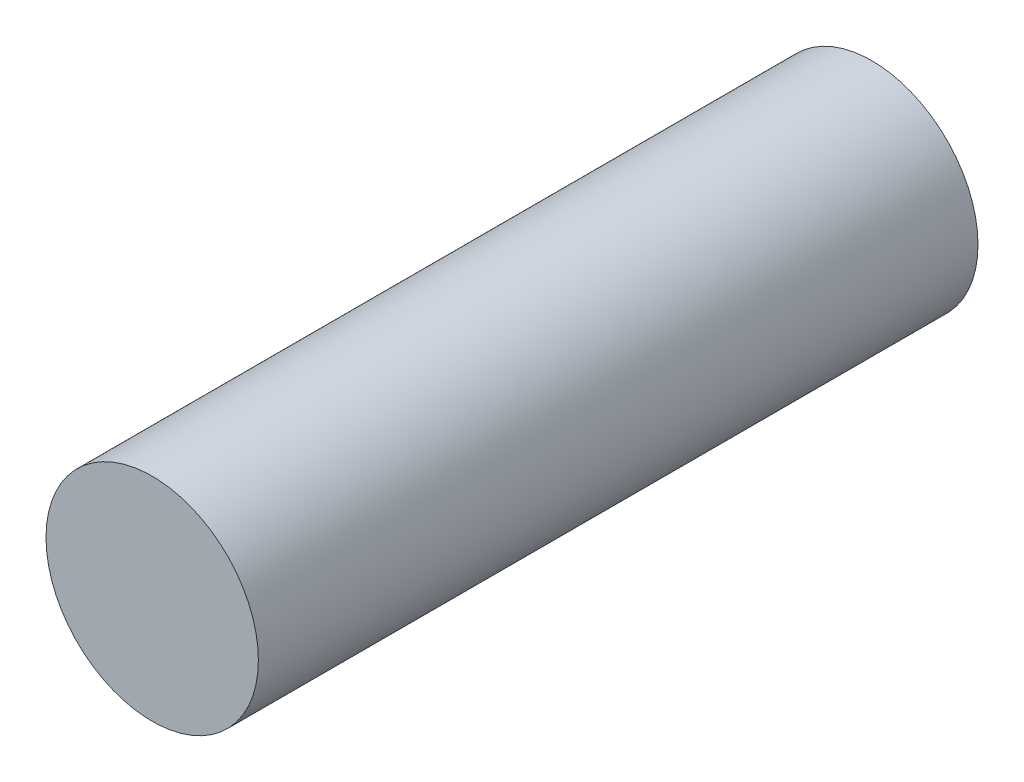
ISO-10303-21;
HEADER;
FILE_DESCRIPTION(('STEP AP214'),'2;1');
FILE_NAME('part.step','',(''),(''),'','','');
FILE_SCHEMA(('AUTOMOTIVE_DESIGN { 1 0 10303 214 1 1 1 1 }'));
ENDSEC;
DATA;
#1=APPLICATION_CONTEXT('core data for automotive mechanical design processes');
#2=APPLICATION_PROTOCOL_DEFINITION('international standard','automotive_design',2000,#1);
#3=PRODUCT_CONTEXT('',#1,'mechanical');
#4=PRODUCT('Part','Part','',(#3));
#5=PRODUCT_RELATED_PRODUCT_CATEGORY('part','',(#4));
#6=PRODUCT_DEFINITION_FORMATION('','',#4);
#7=PRODUCT_DEFINITION_CONTEXT('part definition',#1,'design');
#8=PRODUCT_DEFINITION('design','',#6,#7);
#9=PRODUCT_DEFINITION_SHAPE('','',#8);
#10=(LENGTH_UNIT() NAMED_UNIT(*) SI_UNIT(.MILLI.,.METRE.));
#11=(NAMED_UNIT(*) PLANE_ANGLE_UNIT() SI_UNIT($,.RADIAN.));
#12=(NAMED_UNIT(*) SI_UNIT($,.STERADIAN.) SOLID_ANGLE_UNIT());
#13=UNCERTAINTY_MEASURE_WITH_UNIT(LENGTH_MEASURE(1.E-05),#10,'distance_accuracy_value','');
#14=(GEOMETRIC_REPRESENTATION_CONTEXT(3) GLOBAL_UNCERTAINTY_ASSIGNED_CONTEXT((#13)) GLOBAL_UNIT_ASSIGNED_CONTEXT((#10,
#11,#12)) REPRESENTATION_CONTEXT('',''));
#15=CARTESIAN_POINT('',(0.,0.,0.));
#16=DIRECTION('',(0.,0.,1.));
#17=DIRECTION('',(1.,0.,0.));
#18=AXIS2_PLACEMENT_3D('',#15,#16,#17);
#19=CARTESIAN_POINT('',(-3.719,5.173,11.731));
#20=DIRECTION('',(0.,0.,-1.));
#21=DIRECTION('',(-1.,0.,0.));
#22=AXIS2_PLACEMENT_3D('',#19,#20,#21);
#23=CYLINDRICAL_SURFACE('',#22,1.731);
#24=CARTESIAN_POINT('',(-3.719,5.173,11.731));
#25=DIRECTION('',(0.,0.,1.));
#26=DIRECTION('',(1.,0.,0.));
#27=AXIS2_PLACEMENT_3D('',#24,#25,#26);
#28=CIRCLE('',#27,1.731);
#29=CARTESIAN_POINT('',(-1.988,5.173,11.731));
#30=VERTEX_POINT('',#29);
#31=EDGE_CURVE('E10',#30,#30,#28,.T.);
#32=ORIENTED_EDGE('',*,*,#31,.F.);
#33=EDGE_LOOP('',(#32));
#34=FACE_BOUND('',#33,.T.);
#35=CARTESIAN_POINT('',(-3.719,5.173,0.));
#36=DIRECTION('',(0.,0.,1.));
#37=DIRECTION('',(1.,0.,0.));
#38=AXIS2_PLACEMENT_3D('',#35,#36,#37);
#39=CIRCLE('',#38,1.731);
#40=CARTESIAN_POINT('',(-1.988,5.173,0.));
#41=VERTEX_POINT('',#40);
#42=EDGE_CURVE('E45',#41,#41,#39,.T.);
#43=ORIENTED_EDGE('',*,*,#42,.T.);
#44=EDGE_LOOP('',(#43));
#45=FACE_BOUND('',#44,.T.);
#46=ADVANCED_FACE('F39',(#34,#45),#23,.T.);
#47=CARTESIAN_POINT('',(-3.719,5.173,11.731));
#48=DIRECTION('',(0.,0.,1.));
#49=DIRECTION('',(1.,0.,0.));
#50=AXIS2_PLACEMENT_3D('',#47,#48,#49);
#51=PLANE('',#50);
#52=ORIENTED_EDGE('',*,*,#31,.T.);
#53=EDGE_LOOP('',(#52));
#54=FACE_BOUND('',#53,.T.);
#55=ADVANCED_FACE('F53',(#54),#51,.T.);
#56=CARTESIAN_POINT('',(-3.719,5.173,0.));
#57=DIRECTION('',(0.,0.,1.));
#58=DIRECTION('',(1.,0.,0.));
#59=AXIS2_PLACEMENT_3D('',#56,#57,#58);
#60=PLANE('',#59);
#61=ORIENTED_EDGE('',*,*,#42,.F.);
#62=EDGE_LOOP('',(#61));
#63=FACE_BOUND('',#62,.T.);
#64=ADVANCED_FACE('F55',(#63),#60,.F.);
#65=CLOSED_SHELL('',(#46,#55,#64));
#66=MANIFOLD_SOLID_BREP('B2',#65);
#67=ADVANCED_BREP_SHAPE_REPRESENTATION('',(#18,#66),#14);
#68=SHAPE_DEFINITION_REPRESENTATION(#9,#67);
ENDSEC;
END-ISO-10303-21;
